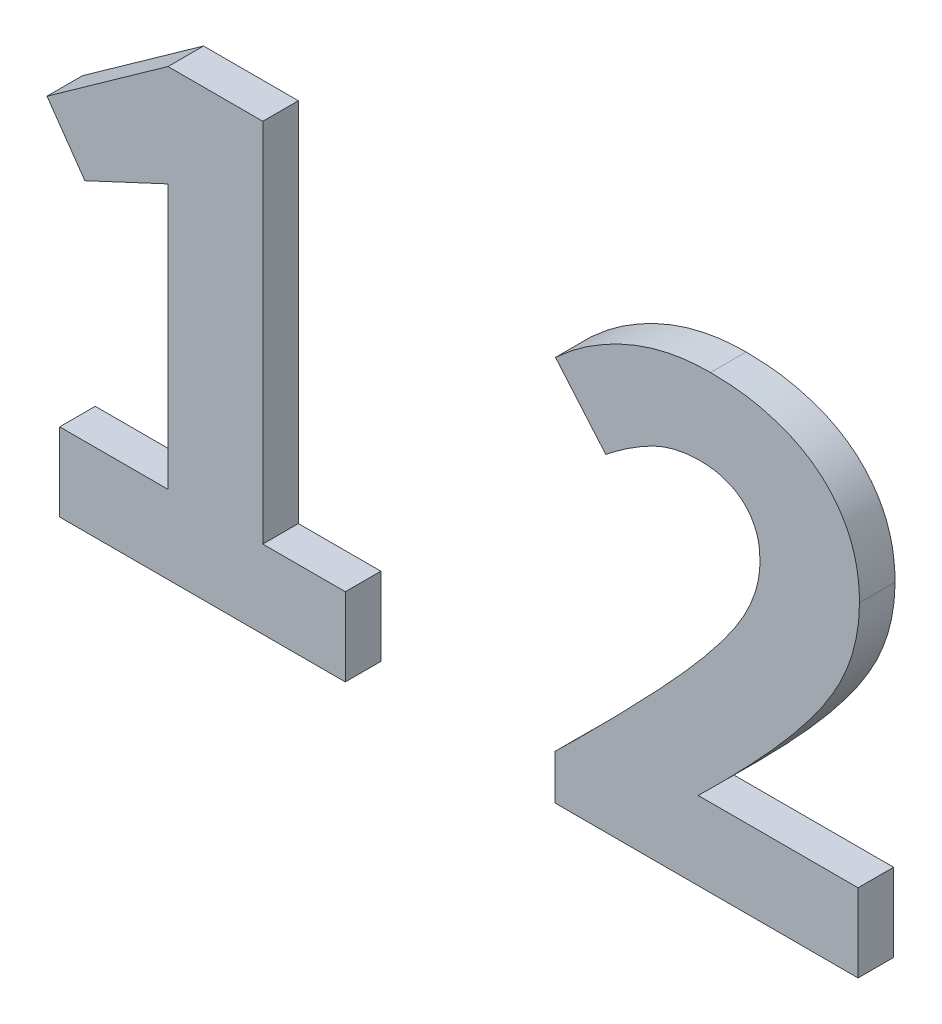
ISO-10303-21;
HEADER;
FILE_DESCRIPTION(('STEP AP214'),'2;1');
FILE_NAME('part.step','',(''),(''),'','','');
FILE_SCHEMA(('AUTOMOTIVE_DESIGN { 1 0 10303 214 1 1 1 1 }'));
ENDSEC;
DATA;
#1=APPLICATION_CONTEXT('core data for automotive mechanical design processes');
#2=APPLICATION_PROTOCOL_DEFINITION('international standard','automotive_design',2000,#1);
#3=PRODUCT_CONTEXT('',#1,'mechanical');
#4=PRODUCT('Part','Part','',(#3));
#5=PRODUCT_RELATED_PRODUCT_CATEGORY('part','',(#4));
#6=PRODUCT_DEFINITION_FORMATION('','',#4);
#7=PRODUCT_DEFINITION_CONTEXT('part definition',#1,'design');
#8=PRODUCT_DEFINITION('design','',#6,#7);
#9=PRODUCT_DEFINITION_SHAPE('','',#8);
#10=(LENGTH_UNIT() NAMED_UNIT(*) SI_UNIT(.MILLI.,.METRE.));
#11=(NAMED_UNIT(*) PLANE_ANGLE_UNIT() SI_UNIT($,.RADIAN.));
#12=(NAMED_UNIT(*) SI_UNIT($,.STERADIAN.) SOLID_ANGLE_UNIT());
#13=UNCERTAINTY_MEASURE_WITH_UNIT(LENGTH_MEASURE(1.E-05),#10,'distance_accuracy_value','');
#14=(GEOMETRIC_REPRESENTATION_CONTEXT(3) GLOBAL_UNCERTAINTY_ASSIGNED_CONTEXT((#13)) GLOBAL_UNIT_ASSIGNED_CONTEXT((#10,
#11,#12)) REPRESENTATION_CONTEXT('',''));
#15=CARTESIAN_POINT('',(0.,0.,0.));
#16=DIRECTION('',(0.,0.,1.));
#17=DIRECTION('',(1.,0.,0.));
#18=AXIS2_PLACEMENT_3D('',#15,#16,#17);
#19=CARTESIAN_POINT('',(39.4810267857143,25.3571428571429,2.));
#20=CARTESIAN_POINT('',(39.8775630175165,25.3467735119428,2.));
#21=CARTESIAN_POINT('',(40.6489968133177,25.3266006684896,2.));
#22=CARTESIAN_POINT('',(41.7722547125334,25.1912290716957,2.));
#23=CARTESIAN_POINT('',(42.8207286490805,24.9404081710925,2.));
#24=CARTESIAN_POINT('',(43.8017660040214,24.6121458086853,2.));
#25=CARTESIAN_POINT('',(44.6966533559353,24.178492696784,2.));
#26=CARTESIAN_POINT('',(45.5001546872996,23.6429478902119,2.));
#27=CARTESIAN_POINT('',(46.1943220520048,22.9949431965783,2.));
#28=CARTESIAN_POINT('',(46.6906069139186,22.3770029312771,2.));
#29=CARTESIAN_POINT('',(47.0333157907748,21.8401524649098,2.));
#30=CARTESIAN_POINT('',(47.2483922260314,21.405468006084,2.));
#31=CARTESIAN_POINT('',(47.4423310330619,20.9550041207202,2.));
#32=CARTESIAN_POINT('',(47.5895291299069,20.4748134061716,2.));
#33=CARTESIAN_POINT('',(47.7162797174325,19.9729774070355,2.));
#34=CARTESIAN_POINT('',(47.795434728751,19.4439622456257,2.));
#35=CARTESIAN_POINT('',(47.8484011894953,18.8924564959243,2.));
#36=CARTESIAN_POINT('',(47.8541846491921,18.5176197825317,2.));
#37=CARTESIAN_POINT('',(47.8571428571429,18.3258928571429,2.));
#38=B_SPLINE_CURVE_WITH_KNOTS('',3,(#19,#20,#21,#22,#23,#24,#25,#26,#27,#28,#29,#30,#31,#32,#33,
#34,#35,#36,#37),.UNSPECIFIED.,.F.,.F.,(4,1,1,1,1,1,1,1,1,1,1,1,1,1,1,1,4),(0.,
0.0961097362119884,0.186974840312856,0.273579856322793,0.356981031445025,0.437226486427497,
0.5138733592915,0.590114792285446,0.666434822655682,0.705333317111525,0.744244871327499,
0.783847561817158,0.824053780902117,0.865821936297274,0.909180142639729,0.953546140509196,1.),.UNSPECIFIED.);
#39=DIRECTION('',(0.,0.,-1.));
#40=VECTOR('',#39,1.);
#41=SURFACE_OF_LINEAR_EXTRUSION('',#38,#40);
#42=CARTESIAN_POINT('',(39.4810267857143,25.3571428571429,0.));
#43=CARTESIAN_POINT('',(39.8775630175165,25.3467735119428,0.));
#44=CARTESIAN_POINT('',(40.6489968133177,25.3266006684896,0.));
#45=CARTESIAN_POINT('',(41.7722547125334,25.1912290716957,0.));
#46=CARTESIAN_POINT('',(42.8207286490805,24.9404081710925,0.));
#47=CARTESIAN_POINT('',(43.8017660040214,24.6121458086853,0.));
#48=CARTESIAN_POINT('',(44.6966533559353,24.178492696784,0.));
#49=CARTESIAN_POINT('',(45.5001546872996,23.6429478902119,0.));
#50=CARTESIAN_POINT('',(46.1943220520048,22.9949431965783,0.));
#51=CARTESIAN_POINT('',(46.6906069139186,22.3770029312771,0.));
#52=CARTESIAN_POINT('',(47.0333157907748,21.8401524649098,0.));
#53=CARTESIAN_POINT('',(47.2483922260314,21.405468006084,0.));
#54=CARTESIAN_POINT('',(47.4423310330619,20.9550041207202,0.));
#55=CARTESIAN_POINT('',(47.5895291299069,20.4748134061716,0.));
#56=CARTESIAN_POINT('',(47.7162797174325,19.9729774070355,0.));
#57=CARTESIAN_POINT('',(47.795434728751,19.4439622456257,0.));
#58=CARTESIAN_POINT('',(47.8484011894953,18.8924564959243,0.));
#59=CARTESIAN_POINT('',(47.8541846491921,18.5176197825317,0.));
#60=CARTESIAN_POINT('',(47.8571428571429,18.3258928571429,0.));
#61=B_SPLINE_CURVE_WITH_KNOTS('',3,(#42,#43,#44,#45,#46,#47,#48,#49,#50,#51,#52,#53,#54,#55,#56,
#57,#58,#59,#60),.UNSPECIFIED.,.F.,.F.,(4,1,1,1,1,1,1,1,1,1,1,1,1,1,1,1,4),(0.,
0.0961097362119884,0.186974840312856,0.273579856322793,0.356981031445025,0.437226486427497,
0.5138733592915,0.590114792285446,0.666434822655682,0.705333317111525,0.744244871327499,
0.783847561817158,0.824053780902117,0.865821936297274,0.909180142639729,0.953546140509196,1.),.UNSPECIFIED.);
#62=CARTESIAN_POINT('',(39.4810267857143,25.3571428571429,0.));
#63=VERTEX_POINT('',#62);
#64=CARTESIAN_POINT('',(47.8571428571429,18.3258928571429,0.));
#65=VERTEX_POINT('',#64);
#66=EDGE_CURVE('E12',#63,#65,#61,.T.);
#67=ORIENTED_EDGE('',*,*,#66,.F.);
#68=DIRECTION('',(0.,0.,-1.));
#69=VECTOR('',#68,1.);
#70=CARTESIAN_POINT('',(39.4810267857143,25.3571428571429,2.));
#71=LINE('',#70,#69);
#72=CARTESIAN_POINT('',(39.4810267857143,25.3571428571429,2.));
#73=VERTEX_POINT('',#72);
#74=EDGE_CURVE('E119',#73,#63,#71,.T.);
#75=ORIENTED_EDGE('',*,*,#74,.F.);
#76=CARTESIAN_POINT('',(47.8571428571429,18.3258928571429,2.));
#77=VERTEX_POINT('',#76);
#78=EDGE_CURVE('E51',#73,#77,#38,.T.);
#79=ORIENTED_EDGE('',*,*,#78,.T.);
#80=DIRECTION('',(0.,0.,-1.));
#81=VECTOR('',#80,1.);
#82=CARTESIAN_POINT('',(47.8571428571429,18.3258928571429,2.));
#83=LINE('',#82,#81);
#84=EDGE_CURVE('E69',#77,#65,#83,.T.);
#85=ORIENTED_EDGE('',*,*,#84,.T.);
#86=EDGE_LOOP('',(#67,#75,#79,#85));
#87=FACE_BOUND('',#86,.T.);
#88=ADVANCED_FACE('F47',(#87),#41,.T.);
#89=CARTESIAN_POINT('',(30.7533482142857,21.7299107142857,2.));
#90=CARTESIAN_POINT('',(31.0608750589365,22.0039046825177,2.));
#91=CARTESIAN_POINT('',(31.6723051397179,22.5486641304935,2.));
#92=CARTESIAN_POINT('',(32.6741013679594,23.2539530436693,2.));
#93=CARTESIAN_POINT('',(33.7211138120256,23.8785354134886,2.));
#94=CARTESIAN_POINT('',(34.8166296060064,24.4065220884195,2.));
#95=CARTESIAN_POINT('',(35.9482374561546,24.834944769429,2.));
#96=CARTESIAN_POINT('',(37.1080819259827,25.1356281973565,2.));
#97=CARTESIAN_POINT('',(38.2882974156387,25.3208998536997,2.));
#98=CARTESIAN_POINT('',(39.0822976356979,25.3450268295515,2.));
#99=CARTESIAN_POINT('',(39.4810267857143,25.3571428571429,2.));
#100=B_SPLINE_CURVE_WITH_KNOTS('',3,(#89,#90,#91,#92,#93,#94,#95,#96,#97,#98,#99),.UNSPECIFIED.,
.F.,.F.,(4,1,1,1,1,1,1,1,4),(0.,0.127643117944282,0.253782208849111,0.3792295198782,
0.505396308586074,0.63043842483801,0.753846458636853,0.876387197582966,1.),.UNSPECIFIED.);
#101=DIRECTION('',(0.,0.,-1.));
#102=VECTOR('',#101,1.);
#103=SURFACE_OF_LINEAR_EXTRUSION('',#100,#102);
#104=CARTESIAN_POINT('',(30.7533482142857,21.7299107142857,0.));
#105=CARTESIAN_POINT('',(31.0608750589365,22.0039046825177,0.));
#106=CARTESIAN_POINT('',(31.6723051397179,22.5486641304935,0.));
#107=CARTESIAN_POINT('',(32.6741013679594,23.2539530436693,0.));
#108=CARTESIAN_POINT('',(33.7211138120256,23.8785354134886,0.));
#109=CARTESIAN_POINT('',(34.8166296060064,24.4065220884195,0.));
#110=CARTESIAN_POINT('',(35.9482374561546,24.834944769429,0.));
#111=CARTESIAN_POINT('',(37.1080819259827,25.1356281973565,0.));
#112=CARTESIAN_POINT('',(38.2882974156387,25.3208998536997,0.));
#113=CARTESIAN_POINT('',(39.0822976356979,25.3450268295515,0.));
#114=CARTESIAN_POINT('',(39.4810267857143,25.3571428571429,0.));
#115=B_SPLINE_CURVE_WITH_KNOTS('',3,(#104,#105,#106,#107,#108,#109,#110,#111,#112,#113,#114),
.UNSPECIFIED.,.F.,.F.,(4,1,1,1,1,1,1,1,4),(0.,0.127643117944282,0.253782208849111,
0.3792295198782,0.505396308586074,0.63043842483801,0.753846458636853,0.876387197582966,1.),.UNSPECIFIED.);
#116=CARTESIAN_POINT('',(30.7533482142857,21.7299107142857,0.));
#117=VERTEX_POINT('',#116);
#118=EDGE_CURVE('E270',#117,#63,#115,.T.);
#119=ORIENTED_EDGE('',*,*,#118,.F.);
#120=DIRECTION('',(0.,0.,-1.));
#121=VECTOR('',#120,1.);
#122=CARTESIAN_POINT('',(30.7533482142857,21.7299107142857,2.));
#123=LINE('',#122,#121);
#124=CARTESIAN_POINT('',(30.7533482142857,21.7299107142857,2.));
#125=VERTEX_POINT('',#124);
#126=EDGE_CURVE('E265',#125,#117,#123,.T.);
#127=ORIENTED_EDGE('',*,*,#126,.F.);
#128=EDGE_CURVE('E173',#125,#73,#100,.T.);
#129=ORIENTED_EDGE('',*,*,#128,.T.);
#130=ORIENTED_EDGE('',*,*,#74,.T.);
#131=EDGE_LOOP('',(#119,#127,#129,#130));
#132=FACE_BOUND('',#131,.T.);
#133=ADVANCED_FACE('F187',(#132),#103,.T.);
#134=CARTESIAN_POINT('',(33.5825892857143,18.4151785714286,2.));
#135=DIRECTION('',(-0.760610767097449,-0.649208179997318,0.));
#136=DIRECTION('',(0.649208179997318,-0.760610767097449,0.));
#137=AXIS2_PLACEMENT_3D('',#134,#135,#136);
#138=PLANE('',#137);
#139=DIRECTION('',(-0.649208179997318,0.760610767097449,0.));
#140=VECTOR('',#139,1.);
#141=CARTESIAN_POINT('',(33.5825892857143,18.4151785714286,0.));
#142=LINE('',#141,#140);
#143=CARTESIAN_POINT('',(33.5825892857143,18.4151785714286,0.));
#144=VERTEX_POINT('',#143);
#145=EDGE_CURVE('E280',#144,#117,#142,.T.);
#146=ORIENTED_EDGE('',*,*,#145,.F.);
#147=DIRECTION('',(0.,0.,-1.));
#148=VECTOR('',#147,1.);
#149=CARTESIAN_POINT('',(33.5825892857143,18.4151785714286,2.));
#150=LINE('',#149,#148);
#151=CARTESIAN_POINT('',(33.5825892857143,18.4151785714286,2.));
#152=VERTEX_POINT('',#151);
#153=EDGE_CURVE('E267',#152,#144,#150,.T.);
#154=ORIENTED_EDGE('',*,*,#153,.F.);
#155=DIRECTION('',(-0.649208179997318,0.760610767097449,0.));
#156=VECTOR('',#155,1.);
#157=CARTESIAN_POINT('',(33.5825892857143,18.4151785714286,2.));
#158=LINE('',#157,#156);
#159=EDGE_CURVE('E181',#152,#125,#158,.T.);
#160=ORIENTED_EDGE('',*,*,#159,.T.);
#161=ORIENTED_EDGE('',*,*,#126,.T.);
#162=EDGE_LOOP('',(#146,#154,#160,#161));
#163=FACE_BOUND('',#162,.T.);
#164=ADVANCED_FACE('F190',(#163),#138,.T.);
#165=CARTESIAN_POINT('',(38.8448660714286,20.7645089285714,2.));
#166=CARTESIAN_POINT('',(38.6249057726877,20.7565650739918,2.));
#167=CARTESIAN_POINT('',(38.1840740373727,20.7406444591377,2.));
#168=CARTESIAN_POINT('',(37.530834948255,20.6249247916508,2.));
#169=CARTESIAN_POINT('',(36.8878088612126,20.4411575923926,2.));
#170=CARTESIAN_POINT('',(36.2566327816543,20.171734145863,2.));
#171=CARTESIAN_POINT('',(35.6219299127891,19.8285885895323,2.));
#172=CARTESIAN_POINT('',(34.961319782203,19.4260810708243,2.));
#173=CARTESIAN_POINT('',(34.2758894824289,18.9500837236002,2.));
#174=CARTESIAN_POINT('',(33.8191337594688,18.5976808385974,2.));
#175=CARTESIAN_POINT('',(33.5825892857143,18.4151785714286,2.));
#176=B_SPLINE_CURVE_WITH_KNOTS('',3,(#165,#166,#167,#168,#169,#170,#171,#172,#173,#174,#175),
.UNSPECIFIED.,.F.,.F.,(4,1,1,1,1,1,1,1,4),(0.,0.112222152012101,0.224909159950476,
0.337580170301045,0.452892018850434,0.574355252089031,0.705587745177032,0.84752989752891,1.),.UNSPECIFIED.);
#177=DIRECTION('',(0.,0.,-1.));
#178=VECTOR('',#177,1.);
#179=SURFACE_OF_LINEAR_EXTRUSION('',#176,#178);
#180=CARTESIAN_POINT('',(38.8448660714286,20.7645089285714,0.));
#181=CARTESIAN_POINT('',(38.6249057726877,20.7565650739918,0.));
#182=CARTESIAN_POINT('',(38.1840740373727,20.7406444591377,0.));
#183=CARTESIAN_POINT('',(37.530834948255,20.6249247916508,0.));
#184=CARTESIAN_POINT('',(36.8878088612126,20.4411575923926,0.));
#185=CARTESIAN_POINT('',(36.2566327816543,20.171734145863,0.));
#186=CARTESIAN_POINT('',(35.6219299127891,19.8285885895323,0.));
#187=CARTESIAN_POINT('',(34.961319782203,19.4260810708243,0.));
#188=CARTESIAN_POINT('',(34.2758894824289,18.9500837236002,0.));
#189=CARTESIAN_POINT('',(33.8191337594688,18.5976808385974,0.));
#190=CARTESIAN_POINT('',(33.5825892857143,18.4151785714286,0.));
#191=B_SPLINE_CURVE_WITH_KNOTS('',3,(#180,#181,#182,#183,#184,#185,#186,#187,#188,#189,#190),
.UNSPECIFIED.,.F.,.F.,(4,1,1,1,1,1,1,1,4),(0.,0.112222152012101,0.224909159950476,
0.337580170301045,0.452892018850434,0.574355252089031,0.705587745177032,0.84752989752891,1.),.UNSPECIFIED.);
#192=CARTESIAN_POINT('',(38.8448660714286,20.7645089285714,0.));
#193=VERTEX_POINT('',#192);
#194=EDGE_CURVE('E285',#193,#144,#191,.T.);
#195=ORIENTED_EDGE('',*,*,#194,.F.);
#196=DIRECTION('',(0.,0.,-1.));
#197=VECTOR('',#196,1.);
#198=CARTESIAN_POINT('',(38.8448660714286,20.7645089285714,2.));
#199=LINE('',#198,#197);
#200=CARTESIAN_POINT('',(38.8448660714286,20.7645089285714,2.));
#201=VERTEX_POINT('',#200);
#202=EDGE_CURVE('E272',#201,#193,#199,.T.);
#203=ORIENTED_EDGE('',*,*,#202,.F.);
#204=EDGE_CURVE('E250',#201,#152,#176,.T.);
#205=ORIENTED_EDGE('',*,*,#204,.T.);
#206=ORIENTED_EDGE('',*,*,#153,.T.);
#207=EDGE_LOOP('',(#195,#203,#205,#206));
#208=FACE_BOUND('',#207,.T.);
#209=ADVANCED_FACE('F246',(#208),#179,.T.);
#210=CARTESIAN_POINT('',(42.265625,17.5446428571429,2.));
#211=CARTESIAN_POINT('',(42.2561243229866,17.7875235252135,2.));
#212=CARTESIAN_POINT('',(42.2380340053104,18.2499946140205,2.));
#213=CARTESIAN_POINT('',(42.0684419239859,18.9031330563683,2.));
#214=CARTESIAN_POINT('',(41.7806350724015,19.4691580170428,2.));
#215=CARTESIAN_POINT('',(41.3750496122598,19.9406411702685,2.));
#216=CARTESIAN_POINT('',(40.8699690674399,20.3152502739148,2.));
#217=CARTESIAN_POINT('',(40.2701795356669,20.5751131901605,2.));
#218=CARTESIAN_POINT('',(39.5868911532659,20.7436418077172,2.));
#219=CARTESIAN_POINT('',(39.1008083523064,20.7573113571719,2.));
#220=CARTESIAN_POINT('',(38.8448660714286,20.7645089285714,2.));
#221=B_SPLINE_CURVE_WITH_KNOTS('',3,(#210,#211,#212,#213,#214,#215,#216,#217,#218,#219,#220),
.UNSPECIFIED.,.F.,.F.,(4,1,1,1,1,1,1,1,4),(0.,0.13646426153162,0.259842729003947,
0.376400258087719,0.490718277221435,0.606686925908083,0.727090681598444,0.856302191135717,1.),.UNSPECIFIED.);
#222=DIRECTION('',(0.,0.,-1.));
#223=VECTOR('',#222,1.);
#224=SURFACE_OF_LINEAR_EXTRUSION('',#221,#223);
#225=CARTESIAN_POINT('',(42.265625,17.5446428571429,0.));
#226=CARTESIAN_POINT('',(42.2561243229866,17.7875235252135,0.));
#227=CARTESIAN_POINT('',(42.2380340053104,18.2499946140205,0.));
#228=CARTESIAN_POINT('',(42.0684419239859,18.9031330563683,0.));
#229=CARTESIAN_POINT('',(41.7806350724015,19.4691580170428,0.));
#230=CARTESIAN_POINT('',(41.3750496122598,19.9406411702685,0.));
#231=CARTESIAN_POINT('',(40.8699690674399,20.3152502739148,0.));
#232=CARTESIAN_POINT('',(40.2701795356669,20.5751131901605,0.));
#233=CARTESIAN_POINT('',(39.5868911532659,20.7436418077172,0.));
#234=CARTESIAN_POINT('',(39.1008083523064,20.7573113571719,0.));
#235=CARTESIAN_POINT('',(38.8448660714286,20.7645089285714,0.));
#236=B_SPLINE_CURVE_WITH_KNOTS('',3,(#225,#226,#227,#228,#229,#230,#231,#232,#233,#234,#235),
.UNSPECIFIED.,.F.,.F.,(4,1,1,1,1,1,1,1,4),(0.,0.13646426153162,0.259842729003947,
0.376400258087719,0.490718277221435,0.606686925908083,0.727090681598444,0.856302191135717,1.),.UNSPECIFIED.);
#237=CARTESIAN_POINT('',(42.265625,17.5446428571429,0.));
#238=VERTEX_POINT('',#237);
#239=EDGE_CURVE('E290',#238,#193,#236,.T.);
#240=ORIENTED_EDGE('',*,*,#239,.F.);
#241=DIRECTION('',(0.,0.,-1.));
#242=VECTOR('',#241,1.);
#243=CARTESIAN_POINT('',(42.265625,17.5446428571429,2.));
#244=LINE('',#243,#242);
#245=CARTESIAN_POINT('',(42.265625,17.5446428571429,2.));
#246=VERTEX_POINT('',#245);
#247=EDGE_CURVE('E322',#246,#238,#244,.T.);
#248=ORIENTED_EDGE('',*,*,#247,.F.);
#249=EDGE_CURVE('E229',#246,#201,#221,.T.);
#250=ORIENTED_EDGE('',*,*,#249,.T.);
#251=ORIENTED_EDGE('',*,*,#202,.T.);
#252=EDGE_LOOP('',(#240,#248,#250,#251));
#253=FACE_BOUND('',#252,.T.);
#254=ADVANCED_FACE('F242',(#253),#224,.T.);
#255=CARTESIAN_POINT('',(30.7142857142857,2.50558035714286,2.));
#256=CARTESIAN_POINT('',(31.1004266912922,2.88394409759495,2.));
#257=CARTESIAN_POINT('',(31.8501517952957,3.61856904431955,2.));
#258=CARTESIAN_POINT('',(32.9228746686243,4.7054695798845,2.));
#259=CARTESIAN_POINT('',(33.9375362510947,5.71840889230903,2.));
#260=CARTESIAN_POINT('',(34.872825910711,6.67861002894788,2.));
#261=CARTESIAN_POINT('',(35.7384863787572,7.57641174356333,2.));
#262=CARTESIAN_POINT('',(36.5327890184918,8.41535859510536,2.));
#263=CARTESIAN_POINT('',(37.2554129187095,9.19214397302337,2.));
#264=CARTESIAN_POINT('',(37.9096820311756,9.9144129864098,2.));
#265=CARTESIAN_POINT('',(38.5050364884089,10.5861683307705,2.));
#266=CARTESIAN_POINT('',(39.0484718586392,11.2241833563457,2.));
#267=CARTESIAN_POINT('',(39.5422656934633,11.8297115184624,2.));
#268=CARTESIAN_POINT('',(39.9928623646103,12.4010802475528,2.));
#269=CARTESIAN_POINT('',(40.3931652635192,12.9418986484176,2.));
#270=CARTESIAN_POINT('',(40.7517208149486,13.4477496101017,2.));
#271=CARTESIAN_POINT('',(41.0600867029074,13.9218392211048,2.));
#272=CARTESIAN_POINT('',(41.3968134441584,14.5006538326013,2.));
#273=CARTESIAN_POINT('',(41.74090587753,15.1891782222778,2.));
#274=CARTESIAN_POINT('',(42.041357197658,16.000005566947,2.));
#275=CARTESIAN_POINT('',(42.224254087246,16.7832120943444,2.));
#276=CARTESIAN_POINT('',(42.2521365888227,17.2963889384353,2.));
#277=CARTESIAN_POINT('',(42.265625,17.5446428571429,2.));
#278=B_SPLINE_CURVE_WITH_KNOTS('',3,(#255,#256,#257,#258,#259,#260,#261,#262,#263,#264,#265,
#266,#267,#268,#269,#270,#271,#272,#273,#274,#275,#276,#277),.UNSPECIFIED.,.F.,.F.,(4,1,1,1,1,1,
1,1,1,1,1,1,1,1,1,1,1,1,1,1,4),(0.,0.0840551610506944,0.163200147389948,0.237436951377162,
0.30697459397179,0.371610873109773,0.431349711935123,0.48660481885724,0.536565160645855,
0.582872637983791,0.626163722475799,0.666862420817536,0.704353878633928,0.739291898114358,
0.771468019146544,0.800749155306096,0.82718853078316,0.87556328829644,0.920213596285311,
0.961402608847563,1.),.UNSPECIFIED.);
#279=DIRECTION('',(0.,0.,-1.));
#280=VECTOR('',#279,1.);
#281=SURFACE_OF_LINEAR_EXTRUSION('',#278,#280);
#282=CARTESIAN_POINT('',(30.7142857142857,2.50558035714286,0.));
#283=CARTESIAN_POINT('',(31.1004266912922,2.88394409759495,0.));
#284=CARTESIAN_POINT('',(31.8501517952957,3.61856904431955,0.));
#285=CARTESIAN_POINT('',(32.9228746686243,4.7054695798845,0.));
#286=CARTESIAN_POINT('',(33.9375362510947,5.71840889230903,0.));
#287=CARTESIAN_POINT('',(34.872825910711,6.67861002894788,0.));
#288=CARTESIAN_POINT('',(35.7384863787572,7.57641174356333,0.));
#289=CARTESIAN_POINT('',(36.5327890184918,8.41535859510536,0.));
#290=CARTESIAN_POINT('',(37.2554129187095,9.19214397302337,0.));
#291=CARTESIAN_POINT('',(37.9096820311756,9.9144129864098,0.));
#292=CARTESIAN_POINT('',(38.5050364884089,10.5861683307705,0.));
#293=CARTESIAN_POINT('',(39.0484718586392,11.2241833563457,0.));
#294=CARTESIAN_POINT('',(39.5422656934633,11.8297115184624,0.));
#295=CARTESIAN_POINT('',(39.9928623646103,12.4010802475528,0.));
#296=CARTESIAN_POINT('',(40.3931652635192,12.9418986484176,0.));
#297=CARTESIAN_POINT('',(40.7517208149486,13.4477496101017,0.));
#298=CARTESIAN_POINT('',(41.0600867029074,13.9218392211048,0.));
#299=CARTESIAN_POINT('',(41.3968134441584,14.5006538326013,0.));
#300=CARTESIAN_POINT('',(41.74090587753,15.1891782222778,0.));
#301=CARTESIAN_POINT('',(42.041357197658,16.000005566947,0.));
#302=CARTESIAN_POINT('',(42.224254087246,16.7832120943444,0.));
#303=CARTESIAN_POINT('',(42.2521365888227,17.2963889384353,0.));
#304=CARTESIAN_POINT('',(42.265625,17.5446428571429,0.));
#305=B_SPLINE_CURVE_WITH_KNOTS('',3,(#282,#283,#284,#285,#286,#287,#288,#289,#290,#291,#292,
#293,#294,#295,#296,#297,#298,#299,#300,#301,#302,#303,#304),.UNSPECIFIED.,.F.,.F.,(4,1,1,1,1,1,
1,1,1,1,1,1,1,1,1,1,1,1,1,1,4),(0.,0.0840551610506944,0.163200147389948,0.237436951377162,
0.30697459397179,0.371610873109773,0.431349711935123,0.48660481885724,0.536565160645855,
0.582872637983791,0.626163722475799,0.666862420817536,0.704353878633928,0.739291898114358,
0.771468019146544,0.800749155306096,0.82718853078316,0.87556328829644,0.920213596285311,
0.961402608847563,1.),.UNSPECIFIED.);
#306=CARTESIAN_POINT('',(30.7142857142857,2.50558035714286,0.));
#307=VERTEX_POINT('',#306);
#308=EDGE_CURVE('E298',#307,#238,#305,.T.);
#309=ORIENTED_EDGE('',*,*,#308,.F.);
#310=DIRECTION('',(0.,0.,-1.));
#311=VECTOR('',#310,1.);
#312=CARTESIAN_POINT('',(30.7142857142857,2.50558035714286,2.));
#313=LINE('',#312,#311);
#314=CARTESIAN_POINT('',(30.7142857142857,2.50558035714286,2.));
#315=VERTEX_POINT('',#314);
#316=EDGE_CURVE('E318',#315,#307,#313,.T.);
#317=ORIENTED_EDGE('',*,*,#316,.F.);
#318=EDGE_CURVE('E223',#315,#246,#278,.T.);
#319=ORIENTED_EDGE('',*,*,#318,.T.);
#320=ORIENTED_EDGE('',*,*,#247,.T.);
#321=EDGE_LOOP('',(#309,#317,#319,#320));
#322=FACE_BOUND('',#321,.T.);
#323=ADVANCED_FACE('F237',(#322),#281,.T.);
#324=CARTESIAN_POINT('',(30.7142857142857,0.,2.));
#325=DIRECTION('',(-1.,0.,0.));
#326=DIRECTION('',(0.,0.,1.));
#327=AXIS2_PLACEMENT_3D('',#324,#325,#326);
#328=PLANE('',#327);
#329=DIRECTION('',(0.,1.,0.));
#330=VECTOR('',#329,1.);
#331=CARTESIAN_POINT('',(30.7142857142857,0.,0.));
#332=LINE('',#331,#330);
#333=CARTESIAN_POINT('',(30.7142857142857,0.,0.));
#334=VERTEX_POINT('',#333);
#335=EDGE_CURVE('E306',#334,#307,#332,.T.);
#336=ORIENTED_EDGE('',*,*,#335,.F.);
#337=DIRECTION('',(0.,0.,-1.));
#338=VECTOR('',#337,1.);
#339=CARTESIAN_POINT('',(30.7142857142857,0.,2.));
#340=LINE('',#339,#338);
#341=CARTESIAN_POINT('',(30.7142857142857,0.,2.));
#342=VERTEX_POINT('',#341);
#343=EDGE_CURVE('E315',#342,#334,#340,.T.);
#344=ORIENTED_EDGE('',*,*,#343,.F.);
#345=DIRECTION('',(0.,1.,0.));
#346=VECTOR('',#345,1.);
#347=CARTESIAN_POINT('',(30.7142857142857,0.,2.));
#348=LINE('',#347,#346);
#349=EDGE_CURVE('E220',#342,#315,#348,.T.);
#350=ORIENTED_EDGE('',*,*,#349,.T.);
#351=ORIENTED_EDGE('',*,*,#316,.T.);
#352=EDGE_LOOP('',(#336,#344,#350,#351));
#353=FACE_BOUND('',#352,.T.);
#354=ADVANCED_FACE('F241',(#353),#328,.T.);
#355=CARTESIAN_POINT('',(47.7790178571429,0.,2.));
#356=DIRECTION('',(0.,-1.,0.));
#357=DIRECTION('',(0.,0.,-1.));
#358=AXIS2_PLACEMENT_3D('',#355,#356,#357);
#359=PLANE('',#358);
#360=DIRECTION('',(-1.,0.,0.));
#361=VECTOR('',#360,1.);
#362=CARTESIAN_POINT('',(47.7790178571429,0.,0.));
#363=LINE('',#362,#361);
#364=CARTESIAN_POINT('',(47.7790178571429,0.,0.));
#365=VERTEX_POINT('',#364);
#366=EDGE_CURVE('E159',#365,#334,#363,.T.);
#367=ORIENTED_EDGE('',*,*,#366,.F.);
#368=DIRECTION('',(0.,0.,-1.));
#369=VECTOR('',#368,1.);
#370=CARTESIAN_POINT('',(47.7790178571429,0.,2.));
#371=LINE('',#370,#369);
#372=CARTESIAN_POINT('',(47.7790178571429,0.,2.));
#373=VERTEX_POINT('',#372);
#374=EDGE_CURVE('E151',#373,#365,#371,.T.);
#375=ORIENTED_EDGE('',*,*,#374,.F.);
#376=DIRECTION('',(-1.,0.,0.));
#377=VECTOR('',#376,1.);
#378=CARTESIAN_POINT('',(47.7790178571429,0.,2.));
#379=LINE('',#378,#377);
#380=EDGE_CURVE('E217',#373,#342,#379,.T.);
#381=ORIENTED_EDGE('',*,*,#380,.T.);
#382=ORIENTED_EDGE('',*,*,#343,.T.);
#383=EDGE_LOOP('',(#367,#375,#381,#382));
#384=FACE_BOUND('',#383,.T.);
#385=ADVANCED_FACE('F313',(#384),#359,.T.);
#386=CARTESIAN_POINT('',(47.7790178571429,4.39732142857143,2.));
#387=DIRECTION('',(1.,0.,0.));
#388=DIRECTION('',(0.,0.,-1.));
#389=AXIS2_PLACEMENT_3D('',#386,#387,#388);
#390=PLANE('',#389);
#391=DIRECTION('',(0.,-1.,0.));
#392=VECTOR('',#391,1.);
#393=CARTESIAN_POINT('',(47.7790178571429,4.39732142857143,0.));
#394=LINE('',#393,#392);
#395=CARTESIAN_POINT('',(47.7790178571429,4.39732142857143,0.));
#396=VERTEX_POINT('',#395);
#397=EDGE_CURVE('E154',#396,#365,#394,.T.);
#398=ORIENTED_EDGE('',*,*,#397,.F.);
#399=DIRECTION('',(0.,0.,-1.));
#400=VECTOR('',#399,1.);
#401=CARTESIAN_POINT('',(47.7790178571429,4.39732142857143,2.));
#402=LINE('',#401,#400);
#403=CARTESIAN_POINT('',(47.7790178571429,4.39732142857143,2.));
#404=VERTEX_POINT('',#403);
#405=EDGE_CURVE('E141',#404,#396,#402,.T.);
#406=ORIENTED_EDGE('',*,*,#405,.F.);
#407=DIRECTION('',(0.,-1.,0.));
#408=VECTOR('',#407,1.);
#409=CARTESIAN_POINT('',(47.7790178571429,4.39732142857143,2.));
#410=LINE('',#409,#408);
#411=EDGE_CURVE('E215',#404,#373,#410,.T.);
#412=ORIENTED_EDGE('',*,*,#411,.T.);
#413=ORIENTED_EDGE('',*,*,#374,.T.);
#414=EDGE_LOOP('',(#398,#406,#412,#413));
#415=FACE_BOUND('',#414,.T.);
#416=ADVANCED_FACE('F155',(#415),#390,.T.);
#417=CARTESIAN_POINT('',(38.7834821428571,4.39732142857143,2.));
#418=DIRECTION('',(0.,1.,0.));
#419=DIRECTION('',(0.,0.,1.));
#420=AXIS2_PLACEMENT_3D('',#417,#418,#419);
#421=PLANE('',#420);
#422=DIRECTION('',(1.,0.,0.));
#423=VECTOR('',#422,1.);
#424=CARTESIAN_POINT('',(38.7834821428571,4.39732142857143,0.));
#425=LINE('',#424,#423);
#426=CARTESIAN_POINT('',(38.7834821428571,4.39732142857143,0.));
#427=VERTEX_POINT('',#426);
#428=EDGE_CURVE('E145',#427,#396,#425,.T.);
#429=ORIENTED_EDGE('',*,*,#428,.F.);
#430=DIRECTION('',(0.,0.,-1.));
#431=VECTOR('',#430,1.);
#432=CARTESIAN_POINT('',(38.7834821428571,4.39732142857143,2.));
#433=LINE('',#432,#431);
#434=CARTESIAN_POINT('',(38.7834821428571,4.39732142857143,2.));
#435=VERTEX_POINT('',#434);
#436=EDGE_CURVE('E107',#435,#427,#433,.T.);
#437=ORIENTED_EDGE('',*,*,#436,.F.);
#438=DIRECTION('',(1.,0.,0.));
#439=VECTOR('',#438,1.);
#440=CARTESIAN_POINT('',(38.7834821428571,4.39732142857143,2.));
#441=LINE('',#440,#439);
#442=EDGE_CURVE('E147',#435,#404,#441,.T.);
#443=ORIENTED_EDGE('',*,*,#442,.T.);
#444=ORIENTED_EDGE('',*,*,#405,.T.);
#445=EDGE_LOOP('',(#429,#437,#443,#444));
#446=FACE_BOUND('',#445,.T.);
#447=ADVANCED_FACE('F143',(#446),#421,.T.);
#448=CARTESIAN_POINT('',(47.8571428571429,18.3258928571429,2.));
#449=CARTESIAN_POINT('',(47.8470475338177,18.012830167029,2.));
#450=CARTESIAN_POINT('',(47.8267513319998,17.3834314508581,2.));
#451=CARTESIAN_POINT('',(47.6741484641266,16.4416620449321,2.));
#452=CARTESIAN_POINT('',(47.4360957871823,15.5005449251264,2.));
#453=CARTESIAN_POINT('',(47.1489999731644,14.7239321764349,2.));
#454=CARTESIAN_POINT('',(46.8695097287071,14.0952904042703,2.));
#455=CARTESIAN_POINT('',(46.6153899984044,13.6031547293964,2.));
#456=CARTESIAN_POINT('',(46.3271587811675,13.0929238028887,2.));
#457=CARTESIAN_POINT('',(45.9997811683148,12.5653506652594,2.));
#458=CARTESIAN_POINT('',(45.6399323008825,12.0197742604977,2.));
#459=CARTESIAN_POINT('',(45.2338605477936,11.4606058832653,2.));
#460=CARTESIAN_POINT('',(44.7940785894311,10.8825361462707,2.));
#461=CARTESIAN_POINT('',(44.3184544102221,10.2813149182223,2.));
#462=CARTESIAN_POINT('',(43.7931504169141,9.65983537955345,2.));
#463=CARTESIAN_POINT('',(43.227946795152,9.00141576564282,2.));
#464=CARTESIAN_POINT('',(42.6051725357198,8.3176886911428,2.));
#465=CARTESIAN_POINT('',(41.9419633218895,7.59346423441738,2.));
#466=CARTESIAN_POINT('',(41.2206388931832,6.84490849118123,2.));
#467=CARTESIAN_POINT('',(40.4567191975671,6.0538002087904,2.));
#468=CARTESIAN_POINT('',(39.6359716117399,5.23750630426941,2.));
#469=CARTESIAN_POINT('',(39.0720190052868,4.68169363109545,2.));
#470=CARTESIAN_POINT('',(38.7834821428571,4.39732142857143,2.));
#471=B_SPLINE_CURVE_WITH_KNOTS('',3,(#448,#449,#450,#451,#452,#453,#454,#455,#456,#457,#458,
#459,#460,#461,#462,#463,#464,#465,#466,#467,#468,#469,#470),.UNSPECIFIED.,.F.,.F.,(4,1,1,1,1,1,
1,1,1,1,1,1,1,1,1,1,1,1,1,1,4),(0.,0.0550422864200131,0.110660086627586,0.167395374584156,
0.22556243737989,0.256023804289519,0.288360075678732,0.32293431142542,0.359070704500387,
0.39754407852721,0.437858272754361,0.480586631473285,0.525294458658724,0.572671081712979,
0.623700202993687,0.677904792606137,0.735323623366226,0.796413035962925,0.860732088068399,
0.928745916082207,1.),.UNSPECIFIED.);
#472=DIRECTION('',(0.,0.,-1.));
#473=VECTOR('',#472,1.);
#474=SURFACE_OF_LINEAR_EXTRUSION('',#471,#473);
#475=CARTESIAN_POINT('',(47.8571428571429,18.3258928571429,0.));
#476=CARTESIAN_POINT('',(47.8470475338177,18.012830167029,0.));
#477=CARTESIAN_POINT('',(47.8267513319998,17.3834314508581,0.));
#478=CARTESIAN_POINT('',(47.6741484641266,16.4416620449321,0.));
#479=CARTESIAN_POINT('',(47.4360957871823,15.5005449251264,0.));
#480=CARTESIAN_POINT('',(47.1489999731644,14.7239321764349,0.));
#481=CARTESIAN_POINT('',(46.8695097287071,14.0952904042703,0.));
#482=CARTESIAN_POINT('',(46.6153899984044,13.6031547293964,0.));
#483=CARTESIAN_POINT('',(46.3271587811675,13.0929238028887,0.));
#484=CARTESIAN_POINT('',(45.9997811683148,12.5653506652594,0.));
#485=CARTESIAN_POINT('',(45.6399323008825,12.0197742604977,0.));
#486=CARTESIAN_POINT('',(45.2338605477936,11.4606058832653,0.));
#487=CARTESIAN_POINT('',(44.7940785894311,10.8825361462707,0.));
#488=CARTESIAN_POINT('',(44.3184544102221,10.2813149182223,0.));
#489=CARTESIAN_POINT('',(43.7931504169141,9.65983537955345,0.));
#490=CARTESIAN_POINT('',(43.227946795152,9.00141576564282,0.));
#491=CARTESIAN_POINT('',(42.6051725357198,8.3176886911428,0.));
#492=CARTESIAN_POINT('',(41.9419633218895,7.59346423441738,0.));
#493=CARTESIAN_POINT('',(41.2206388931832,6.84490849118123,0.));
#494=CARTESIAN_POINT('',(40.4567191975671,6.0538002087904,0.));
#495=CARTESIAN_POINT('',(39.6359716117399,5.23750630426941,0.));
#496=CARTESIAN_POINT('',(39.0720190052868,4.68169363109545,0.));
#497=CARTESIAN_POINT('',(38.7834821428571,4.39732142857143,0.));
#498=B_SPLINE_CURVE_WITH_KNOTS('',3,(#475,#476,#477,#478,#479,#480,#481,#482,#483,#484,#485,
#486,#487,#488,#489,#490,#491,#492,#493,#494,#495,#496,#497),.UNSPECIFIED.,.F.,.F.,(4,1,1,1,1,1,
1,1,1,1,1,1,1,1,1,1,1,1,1,1,4),(0.,0.0550422864200131,0.110660086627586,0.167395374584156,
0.22556243737989,0.256023804289519,0.288360075678732,0.32293431142542,0.359070704500387,
0.39754407852721,0.437858272754361,0.480586631473285,0.525294458658724,0.572671081712979,
0.623700202993687,0.677904792606137,0.735323623366226,0.796413035962925,0.860732088068399,
0.928745916082207,1.),.UNSPECIFIED.);
#499=EDGE_CURVE('E60',#65,#427,#498,.T.);
#500=ORIENTED_EDGE('',*,*,#499,.F.);
#501=ORIENTED_EDGE('',*,*,#84,.F.);
#502=EDGE_CURVE('E206',#77,#435,#471,.T.);
#503=ORIENTED_EDGE('',*,*,#502,.T.);
#504=ORIENTED_EDGE('',*,*,#436,.T.);
#505=EDGE_LOOP('',(#500,#501,#503,#504));
#506=FACE_BOUND('',#505,.T.);
#507=ADVANCED_FACE('F196',(#506),#474,.T.);
#508=CARTESIAN_POINT('',(45.3492227303227,23.7263277307239,2.));
#509=DIRECTION('',(0.,0.,1.));
#510=DIRECTION('',(1.,0.,0.));
#511=AXIS2_PLACEMENT_3D('',#508,#509,#510);
#512=PLANE('',#511);
#513=ORIENTED_EDGE('',*,*,#78,.F.);
#514=ORIENTED_EDGE('',*,*,#128,.F.);
#515=ORIENTED_EDGE('',*,*,#159,.F.);
#516=ORIENTED_EDGE('',*,*,#204,.F.);
#517=ORIENTED_EDGE('',*,*,#249,.F.);
#518=ORIENTED_EDGE('',*,*,#318,.F.);
#519=ORIENTED_EDGE('',*,*,#349,.F.);
#520=ORIENTED_EDGE('',*,*,#380,.F.);
#521=ORIENTED_EDGE('',*,*,#411,.F.);
#522=ORIENTED_EDGE('',*,*,#442,.F.);
#523=ORIENTED_EDGE('',*,*,#502,.F.);
#524=EDGE_LOOP('',(#513,#514,#515,#516,#517,#518,#519,#520,#521,#522,#523));
#525=FACE_BOUND('',#524,.T.);
#526=ADVANCED_FACE('F49',(#525),#512,.T.);
#527=CARTESIAN_POINT('',(45.3492227303227,23.7263277307239,0.));
#528=DIRECTION('',(0.,0.,1.));
#529=DIRECTION('',(1.,0.,0.));
#530=AXIS2_PLACEMENT_3D('',#527,#528,#529);
#531=PLANE('',#530);
#532=ORIENTED_EDGE('',*,*,#66,.T.);
#533=ORIENTED_EDGE('',*,*,#499,.T.);
#534=ORIENTED_EDGE('',*,*,#428,.T.);
#535=ORIENTED_EDGE('',*,*,#397,.T.);
#536=ORIENTED_EDGE('',*,*,#366,.T.);
#537=ORIENTED_EDGE('',*,*,#335,.T.);
#538=ORIENTED_EDGE('',*,*,#308,.T.);
#539=ORIENTED_EDGE('',*,*,#239,.T.);
#540=ORIENTED_EDGE('',*,*,#194,.T.);
#541=ORIENTED_EDGE('',*,*,#145,.T.);
#542=ORIENTED_EDGE('',*,*,#118,.T.);
#543=EDGE_LOOP('',(#532,#533,#534,#535,#536,#537,#538,#539,#540,#541,#542));
#544=FACE_BOUND('',#543,.T.);
#545=ADVANCED_FACE('F161',(#544),#531,.F.);
#546=CLOSED_SHELL('',(#88,#133,#164,#209,#254,#323,#354,#385,#416,#447,#507,#526,#545));
#547=MANIFOLD_SOLID_BREP('B2',#546);
#548=CARTESIAN_POINT('',(14.2857142857143,25.,2.));
#549=DIRECTION('',(1.,0.,0.));
#550=DIRECTION('',(0.,0.,-1.));
#551=AXIS2_PLACEMENT_3D('',#548,#549,#550);
#552=PLANE('',#551);
#553=DIRECTION('',(0.,-1.,0.));
#554=VECTOR('',#553,1.);
#555=CARTESIAN_POINT('',(14.2857142857143,25.,0.));
#556=LINE('',#555,#554);
#557=CARTESIAN_POINT('',(14.2857142857143,25.,0.));
#558=VERTEX_POINT('',#557);
#559=CARTESIAN_POINT('',(14.2857142857143,4.39732142857143,0.));
#560=VERTEX_POINT('',#559);
#561=EDGE_CURVE('E560',#558,#560,#556,.T.);
#562=ORIENTED_EDGE('',*,*,#561,.F.);
#563=DIRECTION('',(0.,0.,-1.));
#564=VECTOR('',#563,1.);
#565=CARTESIAN_POINT('',(14.2857142857143,25.,2.));
#566=LINE('',#565,#564);
#567=CARTESIAN_POINT('',(14.2857142857143,25.,2.));
#568=VERTEX_POINT('',#567);
#569=EDGE_CURVE('E45',#568,#558,#566,.T.);
#570=ORIENTED_EDGE('',*,*,#569,.F.);
#571=DIRECTION('',(0.,-1.,0.));
#572=VECTOR('',#571,1.);
#573=CARTESIAN_POINT('',(14.2857142857143,25.,2.));
#574=LINE('',#573,#572);
#575=CARTESIAN_POINT('',(14.2857142857143,4.39732142857143,2.));
#576=VERTEX_POINT('',#575);
#577=EDGE_CURVE('E589',#568,#576,#574,.T.);
#578=ORIENTED_EDGE('',*,*,#577,.T.);
#579=DIRECTION('',(0.,0.,-1.));
#580=VECTOR('',#579,1.);
#581=CARTESIAN_POINT('',(14.2857142857143,4.39732142857143,2.));
#582=LINE('',#581,#580);
#583=EDGE_CURVE('E448',#576,#560,#582,.T.);
#584=ORIENTED_EDGE('',*,*,#583,.T.);
#585=EDGE_LOOP('',(#562,#570,#578,#584));
#586=FACE_BOUND('',#585,.T.);
#587=ADVANCED_FACE('F445',(#586),#552,.T.);
#588=CARTESIAN_POINT('',(8.95089285714286,25.,2.));
#589=DIRECTION('',(0.,1.,0.));
#590=DIRECTION('',(0.,0.,1.));
#591=AXIS2_PLACEMENT_3D('',#588,#589,#590);
#592=PLANE('',#591);
#593=DIRECTION('',(1.,0.,0.));
#594=VECTOR('',#593,1.);
#595=CARTESIAN_POINT('',(8.95089285714286,25.,0.));
#596=LINE('',#595,#594);
#597=CARTESIAN_POINT('',(8.95089285714286,25.,0.));
#598=VERTEX_POINT('',#597);
#599=EDGE_CURVE('E587',#598,#558,#596,.T.);
#600=ORIENTED_EDGE('',*,*,#599,.F.);
#601=DIRECTION('',(0.,0.,-1.));
#602=VECTOR('',#601,1.);
#603=CARTESIAN_POINT('',(8.95089285714286,25.,2.));
#604=LINE('',#603,#602);
#605=CARTESIAN_POINT('',(8.95089285714286,25.,2.));
#606=VERTEX_POINT('',#605);
#607=EDGE_CURVE('E454',#606,#598,#604,.T.);
#608=ORIENTED_EDGE('',*,*,#607,.F.);
#609=DIRECTION('',(1.,0.,0.));
#610=VECTOR('',#609,1.);
#611=CARTESIAN_POINT('',(8.95089285714286,25.,2.));
#612=LINE('',#611,#610);
#613=EDGE_CURVE('E550',#606,#568,#612,.T.);
#614=ORIENTED_EDGE('',*,*,#613,.T.);
#615=ORIENTED_EDGE('',*,*,#569,.T.);
#616=EDGE_LOOP('',(#600,#608,#614,#615));
#617=FACE_BOUND('',#616,.T.);
#618=ADVANCED_FACE('F607',(#617),#592,.T.);
#619=CARTESIAN_POINT('',(2.14285714285714,20.1506696428571,2.));
#620=DIRECTION('',(-0.580164078444723,0.814499626815376,0.));
#621=DIRECTION('',(-0.814499626815375,-0.580164078444723,0.));
#622=AXIS2_PLACEMENT_3D('',#619,#620,#621);
#623=PLANE('',#622);
#624=DIRECTION('',(0.814499626815375,0.580164078444723,0.));
#625=VECTOR('',#624,1.);
#626=CARTESIAN_POINT('',(2.14285714285714,20.1506696428571,0.));
#627=LINE('',#626,#625);
#628=CARTESIAN_POINT('',(2.14285714285714,20.1506696428571,0.));
#629=VERTEX_POINT('',#628);
#630=EDGE_CURVE('E537',#629,#598,#627,.T.);
#631=ORIENTED_EDGE('',*,*,#630,.F.);
#632=DIRECTION('',(0.,0.,-1.));
#633=VECTOR('',#632,1.);
#634=CARTESIAN_POINT('',(2.14285714285714,20.1506696428571,2.));
#635=LINE('',#634,#633);
#636=CARTESIAN_POINT('',(2.14285714285714,20.1506696428571,2.));
#637=VERTEX_POINT('',#636);
#638=EDGE_CURVE('E532',#637,#629,#635,.T.);
#639=ORIENTED_EDGE('',*,*,#638,.F.);
#640=DIRECTION('',(0.814499626815375,0.580164078444723,0.));
#641=VECTOR('',#640,1.);
#642=CARTESIAN_POINT('',(2.14285714285714,20.1506696428571,2.));
#643=LINE('',#642,#641);
#644=EDGE_CURVE('E535',#637,#606,#643,.T.);
#645=ORIENTED_EDGE('',*,*,#644,.T.);
#646=ORIENTED_EDGE('',*,*,#607,.T.);
#647=EDGE_LOOP('',(#631,#639,#645,#646));
#648=FACE_BOUND('',#647,.T.);
#649=ADVANCED_FACE('F534',(#648),#623,.T.);
#650=CARTESIAN_POINT('',(4.27455357142857,17.0982142857143,2.));
#651=DIRECTION('',(-0.81986515773937,-0.572556654947787,0.));
#652=DIRECTION('',(0.572556654947787,-0.81986515773937,0.));
#653=AXIS2_PLACEMENT_3D('',#650,#651,#652);
#654=PLANE('',#653);
#655=DIRECTION('',(-0.572556654947787,0.819865157739369,0.));
#656=VECTOR('',#655,1.);
#657=CARTESIAN_POINT('',(4.27455357142857,17.0982142857143,0.));
#658=LINE('',#657,#656);
#659=CARTESIAN_POINT('',(4.27455357142857,17.0982142857143,0.));
#660=VERTEX_POINT('',#659);
#661=EDGE_CURVE('E584',#660,#629,#658,.T.);
#662=ORIENTED_EDGE('',*,*,#661,.F.);
#663=DIRECTION('',(0.,0.,-1.));
#664=VECTOR('',#663,1.);
#665=CARTESIAN_POINT('',(4.27455357142857,17.0982142857143,2.));
#666=LINE('',#665,#664);
#667=CARTESIAN_POINT('',(4.27455357142857,17.0982142857143,2.));
#668=VERTEX_POINT('',#667);
#669=EDGE_CURVE('E542',#668,#660,#666,.T.);
#670=ORIENTED_EDGE('',*,*,#669,.F.);
#671=DIRECTION('',(-0.572556654947787,0.819865157739369,0.));
#672=VECTOR('',#671,1.);
#673=CARTESIAN_POINT('',(4.27455357142857,17.0982142857143,2.));
#674=LINE('',#673,#672);
#675=EDGE_CURVE('E548',#668,#637,#674,.T.);
#676=ORIENTED_EDGE('',*,*,#675,.T.);
#677=ORIENTED_EDGE('',*,*,#638,.T.);
#678=EDGE_LOOP('',(#662,#670,#676,#677));
#679=FACE_BOUND('',#678,.T.);
#680=ADVANCED_FACE('F552',(#679),#654,.T.);
#681=CARTESIAN_POINT('',(8.96205357142857,19.2857142857143,2.));
#682=DIRECTION('',(0.422885465331124,-0.906183139995266,0.));
#683=DIRECTION('',(0.906183139995266,0.422885465331124,0.));
#684=AXIS2_PLACEMENT_3D('',#681,#682,#683);
#685=PLANE('',#684);
#686=DIRECTION('',(-0.906183139995266,-0.422885465331124,0.));
#687=VECTOR('',#686,1.);
#688=CARTESIAN_POINT('',(8.96205357142857,19.2857142857143,0.));
#689=LINE('',#688,#687);
#690=CARTESIAN_POINT('',(8.96205357142857,19.2857142857143,0.));
#691=VERTEX_POINT('',#690);
#692=EDGE_CURVE('E581',#691,#660,#689,.T.);
#693=ORIENTED_EDGE('',*,*,#692,.F.);
#694=DIRECTION('',(0.,0.,-1.));
#695=VECTOR('',#694,1.);
#696=CARTESIAN_POINT('',(8.96205357142857,19.2857142857143,2.));
#697=LINE('',#696,#695);
#698=CARTESIAN_POINT('',(8.96205357142857,19.2857142857143,2.));
#699=VERTEX_POINT('',#698);
#700=EDGE_CURVE('E593',#699,#691,#697,.T.);
#701=ORIENTED_EDGE('',*,*,#700,.F.);
#702=DIRECTION('',(-0.906183139995266,-0.422885465331124,0.));
#703=VECTOR('',#702,1.);
#704=CARTESIAN_POINT('',(8.96205357142857,19.2857142857143,2.));
#705=LINE('',#704,#703);
#706=EDGE_CURVE('E553',#699,#668,#705,.T.);
#707=ORIENTED_EDGE('',*,*,#706,.T.);
#708=ORIENTED_EDGE('',*,*,#669,.T.);
#709=EDGE_LOOP('',(#693,#701,#707,#708));
#710=FACE_BOUND('',#709,.T.);
#711=ADVANCED_FACE('F620',(#710),#685,.T.);
#712=CARTESIAN_POINT('',(8.96205357142857,4.39732142857143,2.));
#713=DIRECTION('',(-1.,0.,0.));
#714=DIRECTION('',(0.,0.,1.));
#715=AXIS2_PLACEMENT_3D('',#712,#713,#714);
#716=PLANE('',#715);
#717=DIRECTION('',(0.,1.,0.));
#718=VECTOR('',#717,1.);
#719=CARTESIAN_POINT('',(8.96205357142857,4.39732142857143,0.));
#720=LINE('',#719,#718);
#721=CARTESIAN_POINT('',(8.96205357142857,4.39732142857143,0.));
#722=VERTEX_POINT('',#721);
#723=EDGE_CURVE('E578',#722,#691,#720,.T.);
#724=ORIENTED_EDGE('',*,*,#723,.F.);
#725=DIRECTION('',(0.,0.,-1.));
#726=VECTOR('',#725,1.);
#727=CARTESIAN_POINT('',(8.96205357142857,4.39732142857143,2.));
#728=LINE('',#727,#726);
#729=CARTESIAN_POINT('',(8.96205357142857,4.39732142857143,2.));
#730=VERTEX_POINT('',#729);
#731=EDGE_CURVE('E595',#730,#722,#728,.T.);
#732=ORIENTED_EDGE('',*,*,#731,.F.);
#733=DIRECTION('',(0.,1.,0.));
#734=VECTOR('',#733,1.);
#735=CARTESIAN_POINT('',(8.96205357142857,4.39732142857143,2.));
#736=LINE('',#735,#734);
#737=EDGE_CURVE('E555',#730,#699,#736,.T.);
#738=ORIENTED_EDGE('',*,*,#737,.T.);
#739=ORIENTED_EDGE('',*,*,#700,.T.);
#740=EDGE_LOOP('',(#724,#732,#738,#739));
#741=FACE_BOUND('',#740,.T.);
#742=ADVANCED_FACE('F623',(#741),#716,.T.);
#743=CARTESIAN_POINT('',(2.85714285714286,4.39732142857143,2.));
#744=DIRECTION('',(0.,1.,0.));
#745=DIRECTION('',(0.,0.,1.));
#746=AXIS2_PLACEMENT_3D('',#743,#744,#745);
#747=PLANE('',#746);
#748=DIRECTION('',(1.,0.,0.));
#749=VECTOR('',#748,1.);
#750=CARTESIAN_POINT('',(2.85714285714286,4.39732142857143,0.));
#751=LINE('',#750,#749);
#752=CARTESIAN_POINT('',(2.85714285714286,4.39732142857143,0.));
#753=VERTEX_POINT('',#752);
#754=EDGE_CURVE('E575',#753,#722,#751,.T.);
#755=ORIENTED_EDGE('',*,*,#754,.F.);
#756=DIRECTION('',(0.,0.,-1.));
#757=VECTOR('',#756,1.);
#758=CARTESIAN_POINT('',(2.85714285714286,4.39732142857143,2.));
#759=LINE('',#758,#757);
#760=CARTESIAN_POINT('',(2.85714285714286,4.39732142857143,2.));
#761=VERTEX_POINT('',#760);
#762=EDGE_CURVE('E597',#761,#753,#759,.T.);
#763=ORIENTED_EDGE('',*,*,#762,.F.);
#764=DIRECTION('',(1.,0.,0.));
#765=VECTOR('',#764,1.);
#766=CARTESIAN_POINT('',(2.85714285714286,4.39732142857143,2.));
#767=LINE('',#766,#765);
#768=EDGE_CURVE('E765',#761,#730,#767,.T.);
#769=ORIENTED_EDGE('',*,*,#768,.T.);
#770=ORIENTED_EDGE('',*,*,#731,.T.);
#771=EDGE_LOOP('',(#755,#763,#769,#770));
#772=FACE_BOUND('',#771,.T.);
#773=ADVANCED_FACE('F627',(#772),#747,.T.);
#774=CARTESIAN_POINT('',(2.85714285714286,0.,2.));
#775=DIRECTION('',(-1.,0.,0.));
#776=DIRECTION('',(0.,0.,1.));
#777=AXIS2_PLACEMENT_3D('',#774,#775,#776);
#778=PLANE('',#777);
#779=DIRECTION('',(0.,1.,0.));
#780=VECTOR('',#779,1.);
#781=CARTESIAN_POINT('',(2.85714285714286,0.,0.));
#782=LINE('',#781,#780);
#783=CARTESIAN_POINT('',(2.85714285714286,0.,0.));
#784=VERTEX_POINT('',#783);
#785=EDGE_CURVE('E572',#784,#753,#782,.T.);
#786=ORIENTED_EDGE('',*,*,#785,.F.);
#787=DIRECTION('',(0.,0.,-1.));
#788=VECTOR('',#787,1.);
#789=CARTESIAN_POINT('',(2.85714285714286,0.,2.));
#790=LINE('',#789,#788);
#791=CARTESIAN_POINT('',(2.85714285714286,0.,2.));
#792=VERTEX_POINT('',#791);
#793=EDGE_CURVE('E599',#792,#784,#790,.T.);
#794=ORIENTED_EDGE('',*,*,#793,.F.);
#795=DIRECTION('',(0.,1.,0.));
#796=VECTOR('',#795,1.);
#797=CARTESIAN_POINT('',(2.85714285714286,0.,2.));
#798=LINE('',#797,#796);
#799=EDGE_CURVE('E758',#792,#761,#798,.T.);
#800=ORIENTED_EDGE('',*,*,#799,.T.);
#801=ORIENTED_EDGE('',*,*,#762,.T.);
#802=EDGE_LOOP('',(#786,#794,#800,#801));
#803=FACE_BOUND('',#802,.T.);
#804=ADVANCED_FACE('F631',(#803),#778,.T.);
#805=CARTESIAN_POINT('',(18.9285714285714,0.,2.));
#806=DIRECTION('',(0.,-1.,0.));
#807=DIRECTION('',(0.,0.,-1.));
#808=AXIS2_PLACEMENT_3D('',#805,#806,#807);
#809=PLANE('',#808);
#810=DIRECTION('',(-1.,0.,0.));
#811=VECTOR('',#810,1.);
#812=CARTESIAN_POINT('',(18.9285714285714,0.,0.));
#813=LINE('',#812,#811);
#814=CARTESIAN_POINT('',(18.9285714285714,0.,0.));
#815=VERTEX_POINT('',#814);
#816=EDGE_CURVE('E569',#815,#784,#813,.T.);
#817=ORIENTED_EDGE('',*,*,#816,.F.);
#818=DIRECTION('',(0.,0.,-1.));
#819=VECTOR('',#818,1.);
#820=CARTESIAN_POINT('',(18.9285714285714,0.,2.));
#821=LINE('',#820,#819);
#822=CARTESIAN_POINT('',(18.9285714285714,0.,2.));
#823=VERTEX_POINT('',#822);
#824=EDGE_CURVE('E601',#823,#815,#821,.T.);
#825=ORIENTED_EDGE('',*,*,#824,.F.);
#826=DIRECTION('',(-1.,0.,0.));
#827=VECTOR('',#826,1.);
#828=CARTESIAN_POINT('',(18.9285714285714,0.,2.));
#829=LINE('',#828,#827);
#830=EDGE_CURVE('E754',#823,#792,#829,.T.);
#831=ORIENTED_EDGE('',*,*,#830,.T.);
#832=ORIENTED_EDGE('',*,*,#793,.T.);
#833=EDGE_LOOP('',(#817,#825,#831,#832));
#834=FACE_BOUND('',#833,.T.);
#835=ADVANCED_FACE('F635',(#834),#809,.T.);
#836=CARTESIAN_POINT('',(18.9285714285714,4.39732142857143,2.));
#837=DIRECTION('',(1.,0.,0.));
#838=DIRECTION('',(0.,0.,-1.));
#839=AXIS2_PLACEMENT_3D('',#836,#837,#838);
#840=PLANE('',#839);
#841=DIRECTION('',(0.,-1.,0.));
#842=VECTOR('',#841,1.);
#843=CARTESIAN_POINT('',(18.9285714285714,4.39732142857143,0.));
#844=LINE('',#843,#842);
#845=CARTESIAN_POINT('',(18.9285714285714,4.39732142857143,0.));
#846=VERTEX_POINT('',#845);
#847=EDGE_CURVE('E566',#846,#815,#844,.T.);
#848=ORIENTED_EDGE('',*,*,#847,.F.);
#849=DIRECTION('',(0.,0.,-1.));
#850=VECTOR('',#849,1.);
#851=CARTESIAN_POINT('',(18.9285714285714,4.39732142857143,2.));
#852=LINE('',#851,#850);
#853=CARTESIAN_POINT('',(18.9285714285714,4.39732142857143,2.));
#854=VERTEX_POINT('',#853);
#855=EDGE_CURVE('E602',#854,#846,#852,.T.);
#856=ORIENTED_EDGE('',*,*,#855,.F.);
#857=DIRECTION('',(0.,-1.,0.));
#858=VECTOR('',#857,1.);
#859=CARTESIAN_POINT('',(18.9285714285714,4.39732142857143,2.));
#860=LINE('',#859,#858);
#861=EDGE_CURVE('E770',#854,#823,#860,.T.);
#862=ORIENTED_EDGE('',*,*,#861,.T.);
#863=ORIENTED_EDGE('',*,*,#824,.T.);
#864=EDGE_LOOP('',(#848,#856,#862,#863));
#865=FACE_BOUND('',#864,.T.);
#866=ADVANCED_FACE('F639',(#865),#840,.T.);
#867=CARTESIAN_POINT('',(14.2857142857143,4.39732142857143,2.));
#868=DIRECTION('',(0.,1.,0.));
#869=DIRECTION('',(0.,0.,1.));
#870=AXIS2_PLACEMENT_3D('',#867,#868,#869);
#871=PLANE('',#870);
#872=DIRECTION('',(1.,0.,0.));
#873=VECTOR('',#872,1.);
#874=CARTESIAN_POINT('',(14.2857142857143,4.39732142857143,0.));
#875=LINE('',#874,#873);
#876=EDGE_CURVE('E563',#560,#846,#875,.T.);
#877=ORIENTED_EDGE('',*,*,#876,.F.);
#878=ORIENTED_EDGE('',*,*,#583,.F.);
#879=DIRECTION('',(1.,0.,0.));
#880=VECTOR('',#879,1.);
#881=CARTESIAN_POINT('',(14.2857142857143,4.39732142857143,2.));
#882=LINE('',#881,#880);
#883=EDGE_CURVE('E772',#576,#854,#882,.T.);
#884=ORIENTED_EDGE('',*,*,#883,.T.);
#885=ORIENTED_EDGE('',*,*,#855,.T.);
#886=EDGE_LOOP('',(#877,#878,#884,#885));
#887=FACE_BOUND('',#886,.T.);
#888=ADVANCED_FACE('F604',(#887),#871,.T.);
#889=CARTESIAN_POINT('',(0.,0.,2.));
#890=DIRECTION('',(0.,0.,1.));
#891=DIRECTION('',(1.,0.,0.));
#892=AXIS2_PLACEMENT_3D('',#889,#890,#891);
#893=PLANE('',#892);
#894=ORIENTED_EDGE('',*,*,#577,.F.);
#895=ORIENTED_EDGE('',*,*,#613,.F.);
#896=ORIENTED_EDGE('',*,*,#644,.F.);
#897=ORIENTED_EDGE('',*,*,#675,.F.);
#898=ORIENTED_EDGE('',*,*,#706,.F.);
#899=ORIENTED_EDGE('',*,*,#737,.F.);
#900=ORIENTED_EDGE('',*,*,#768,.F.);
#901=ORIENTED_EDGE('',*,*,#799,.F.);
#902=ORIENTED_EDGE('',*,*,#830,.F.);
#903=ORIENTED_EDGE('',*,*,#861,.F.);
#904=ORIENTED_EDGE('',*,*,#883,.F.);
#905=EDGE_LOOP('',(#894,#895,#896,#897,#898,#899,#900,#901,#902,#903,#904));
#906=FACE_BOUND('',#905,.T.);
#907=ADVANCED_FACE('F546',(#906),#893,.T.);
#908=CARTESIAN_POINT('',(0.,0.,0.));
#909=DIRECTION('',(0.,0.,1.));
#910=DIRECTION('',(1.,0.,0.));
#911=AXIS2_PLACEMENT_3D('',#908,#909,#910);
#912=PLANE('',#911);
#913=ORIENTED_EDGE('',*,*,#561,.T.);
#914=ORIENTED_EDGE('',*,*,#876,.T.);
#915=ORIENTED_EDGE('',*,*,#847,.T.);
#916=ORIENTED_EDGE('',*,*,#816,.T.);
#917=ORIENTED_EDGE('',*,*,#785,.T.);
#918=ORIENTED_EDGE('',*,*,#754,.T.);
#919=ORIENTED_EDGE('',*,*,#723,.T.);
#920=ORIENTED_EDGE('',*,*,#692,.T.);
#921=ORIENTED_EDGE('',*,*,#661,.T.);
#922=ORIENTED_EDGE('',*,*,#630,.T.);
#923=ORIENTED_EDGE('',*,*,#599,.T.);
#924=EDGE_LOOP('',(#913,#914,#915,#916,#917,#918,#919,#920,#921,#922,#923));
#925=FACE_BOUND('',#924,.T.);
#926=ADVANCED_FACE('F606',(#925),#912,.F.);
#927=CLOSED_SHELL('',(#587,#618,#649,#680,#711,#742,#773,#804,#835,#866,#888,#907,#926));
#928=MANIFOLD_SOLID_BREP('B6',#927);
#929=ADVANCED_BREP_SHAPE_REPRESENTATION('',(#18,#547,#928),#14);
#930=SHAPE_DEFINITION_REPRESENTATION(#9,#929);
ENDSEC;
END-ISO-10303-21;
